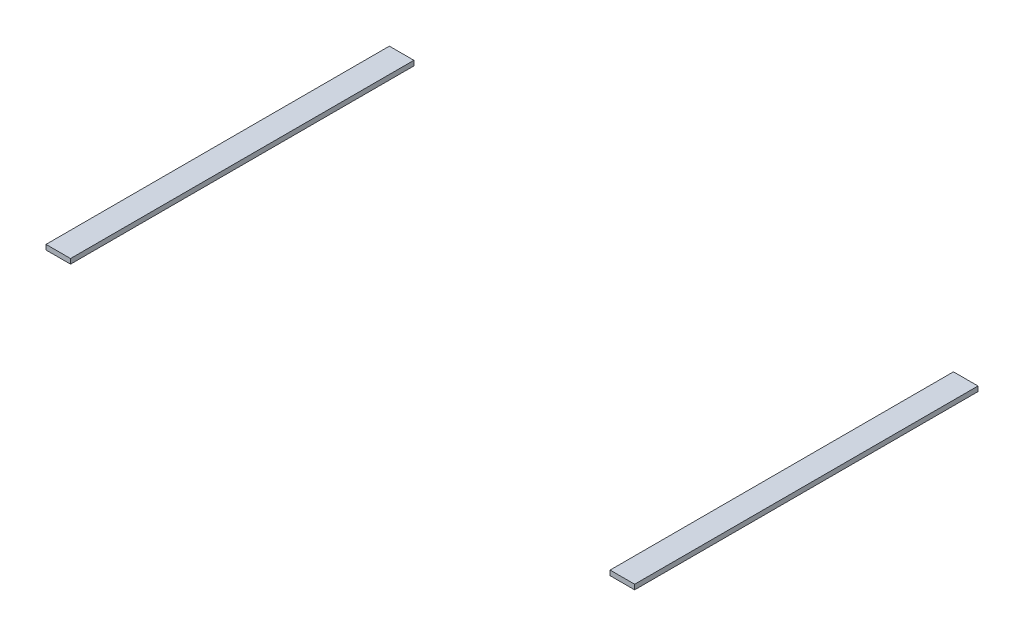
ISO-10303-21;
HEADER;
FILE_DESCRIPTION(('STEP AP214'),'2;1');
FILE_NAME('part.step','',(''),(''),'','','');
FILE_SCHEMA(('AUTOMOTIVE_DESIGN { 1 0 10303 214 1 1 1 1 }'));
ENDSEC;
DATA;
#1=APPLICATION_CONTEXT('core data for automotive mechanical design processes');
#2=APPLICATION_PROTOCOL_DEFINITION('international standard','automotive_design',2000,#1);
#3=PRODUCT_CONTEXT('',#1,'mechanical');
#4=PRODUCT('Part','Part','',(#3));
#5=PRODUCT_RELATED_PRODUCT_CATEGORY('part','',(#4));
#6=PRODUCT_DEFINITION_FORMATION('','',#4);
#7=PRODUCT_DEFINITION_CONTEXT('part definition',#1,'design');
#8=PRODUCT_DEFINITION('design','',#6,#7);
#9=PRODUCT_DEFINITION_SHAPE('','',#8);
#10=(LENGTH_UNIT() NAMED_UNIT(*) SI_UNIT(.MILLI.,.METRE.));
#11=(NAMED_UNIT(*) PLANE_ANGLE_UNIT() SI_UNIT($,.RADIAN.));
#12=(NAMED_UNIT(*) SI_UNIT($,.STERADIAN.) SOLID_ANGLE_UNIT());
#13=UNCERTAINTY_MEASURE_WITH_UNIT(LENGTH_MEASURE(1.E-05),#10,'distance_accuracy_value','');
#14=(GEOMETRIC_REPRESENTATION_CONTEXT(3) GLOBAL_UNCERTAINTY_ASSIGNED_CONTEXT((#13)) GLOBAL_UNIT_ASSIGNED_CONTEXT((#10,
#11,#12)) REPRESENTATION_CONTEXT('',''));
#15=CARTESIAN_POINT('',(0.,0.,0.));
#16=DIRECTION('',(0.,0.,1.));
#17=DIRECTION('',(1.,0.,0.));
#18=AXIS2_PLACEMENT_3D('',#15,#16,#17);
#19=CARTESIAN_POINT('',(120.,2.,70.));
#20=DIRECTION('',(0.,0.,-1.));
#21=DIRECTION('',(-1.,0.,0.));
#22=AXIS2_PLACEMENT_3D('',#19,#20,#21);
#23=PLANE('',#22);
#24=DIRECTION('',(0.,-1.,0.));
#25=VECTOR('',#24,1.);
#26=CARTESIAN_POINT('',(-110.,2.,70.));
#27=LINE('',#26,#25);
#28=CARTESIAN_POINT('',(-110.,2.,70.));
#29=VERTEX_POINT('',#28);
#30=CARTESIAN_POINT('',(-110.,0.,70.));
#31=VERTEX_POINT('',#30);
#32=EDGE_CURVE('E12',#29,#31,#27,.T.);
#33=ORIENTED_EDGE('',*,*,#32,.F.);
#34=DIRECTION('',(1.,0.,0.));
#35=VECTOR('',#34,1.);
#36=CARTESIAN_POINT('',(120.,2.,70.));
#37=LINE('',#36,#35);
#38=CARTESIAN_POINT('',(-120.,2.,70.));
#39=VERTEX_POINT('',#38);
#40=EDGE_CURVE('E93',#39,#29,#37,.T.);
#41=ORIENTED_EDGE('',*,*,#40,.F.);
#42=DIRECTION('',(0.,-1.,0.));
#43=VECTOR('',#42,1.);
#44=CARTESIAN_POINT('',(-120.,2.,70.));
#45=LINE('',#44,#43);
#46=CARTESIAN_POINT('',(-120.,0.,70.));
#47=VERTEX_POINT('',#46);
#48=EDGE_CURVE('E117',#39,#47,#45,.T.);
#49=ORIENTED_EDGE('',*,*,#48,.T.);
#50=DIRECTION('',(1.,0.,0.));
#51=VECTOR('',#50,1.);
#52=CARTESIAN_POINT('',(120.,0.,70.));
#53=LINE('',#52,#51);
#54=EDGE_CURVE('E47',#47,#31,#53,.T.);
#55=ORIENTED_EDGE('',*,*,#54,.T.);
#56=EDGE_LOOP('',(#33,#41,#49,#55));
#57=FACE_BOUND('',#56,.T.);
#58=ADVANCED_FACE('F44',(#57),#23,.F.);
#59=CARTESIAN_POINT('',(120.,2.,-70.));
#60=DIRECTION('',(0.,0.,1.));
#61=DIRECTION('',(1.,0.,0.));
#62=AXIS2_PLACEMENT_3D('',#59,#60,#61);
#63=PLANE('',#62);
#64=DIRECTION('',(0.,-1.,0.));
#65=VECTOR('',#64,1.);
#66=CARTESIAN_POINT('',(-110.,2.,-70.));
#67=LINE('',#66,#65);
#68=CARTESIAN_POINT('',(-110.,2.,-70.));
#69=VERTEX_POINT('',#68);
#70=CARTESIAN_POINT('',(-110.,0.,-70.));
#71=VERTEX_POINT('',#70);
#72=EDGE_CURVE('E78',#69,#71,#67,.T.);
#73=ORIENTED_EDGE('',*,*,#72,.T.);
#74=DIRECTION('',(-1.,0.,0.));
#75=VECTOR('',#74,1.);
#76=CARTESIAN_POINT('',(120.,0.,-70.));
#77=LINE('',#76,#75);
#78=CARTESIAN_POINT('',(-120.,0.,-70.));
#79=VERTEX_POINT('',#78);
#80=EDGE_CURVE('E85',#71,#79,#77,.T.);
#81=ORIENTED_EDGE('',*,*,#80,.T.);
#82=DIRECTION('',(0.,-1.,0.));
#83=VECTOR('',#82,1.);
#84=CARTESIAN_POINT('',(-120.,2.,-70.));
#85=LINE('',#84,#83);
#86=CARTESIAN_POINT('',(-120.,2.,-70.));
#87=VERTEX_POINT('',#86);
#88=EDGE_CURVE('E94',#87,#79,#85,.T.);
#89=ORIENTED_EDGE('',*,*,#88,.F.);
#90=DIRECTION('',(-1.,0.,0.));
#91=VECTOR('',#90,1.);
#92=CARTESIAN_POINT('',(120.,2.,-70.));
#93=LINE('',#92,#91);
#94=EDGE_CURVE('E91',#69,#87,#93,.T.);
#95=ORIENTED_EDGE('',*,*,#94,.F.);
#96=EDGE_LOOP('',(#73,#81,#89,#95));
#97=FACE_BOUND('',#96,.T.);
#98=ADVANCED_FACE('F96',(#97),#63,.F.);
#99=CARTESIAN_POINT('',(0.,2.,0.));
#100=DIRECTION('',(0.,1.,0.));
#101=DIRECTION('',(0.,0.,1.));
#102=AXIS2_PLACEMENT_3D('',#99,#100,#101);
#103=PLANE('',#102);
#104=ORIENTED_EDGE('',*,*,#40,.T.);
#105=DIRECTION('',(0.,0.,1.));
#106=VECTOR('',#105,1.);
#107=CARTESIAN_POINT('',(-110.,2.,-70.));
#108=LINE('',#107,#106);
#109=EDGE_CURVE('E53',#69,#29,#108,.T.);
#110=ORIENTED_EDGE('',*,*,#109,.F.);
#111=ORIENTED_EDGE('',*,*,#94,.T.);
#112=DIRECTION('',(0.,0.,1.));
#113=VECTOR('',#112,1.);
#114=CARTESIAN_POINT('',(-120.,2.,70.));
#115=LINE('',#114,#113);
#116=EDGE_CURVE('E99',#87,#39,#115,.T.);
#117=ORIENTED_EDGE('',*,*,#116,.T.);
#118=EDGE_LOOP('',(#104,#110,#111,#117));
#119=FACE_BOUND('',#118,.T.);
#120=ADVANCED_FACE('F89',(#119),#103,.T.);
#121=CARTESIAN_POINT('',(0.,0.,0.));
#122=DIRECTION('',(0.,1.,0.));
#123=DIRECTION('',(0.,0.,1.));
#124=AXIS2_PLACEMENT_3D('',#121,#122,#123);
#125=PLANE('',#124);
#126=DIRECTION('',(0.,0.,1.));
#127=VECTOR('',#126,1.);
#128=CARTESIAN_POINT('',(-110.,0.,-70.));
#129=LINE('',#128,#127);
#130=EDGE_CURVE('E81',#71,#31,#129,.T.);
#131=ORIENTED_EDGE('',*,*,#130,.T.);
#132=ORIENTED_EDGE('',*,*,#54,.F.);
#133=DIRECTION('',(0.,0.,1.));
#134=VECTOR('',#133,1.);
#135=CARTESIAN_POINT('',(-120.,0.,70.));
#136=LINE('',#135,#134);
#137=EDGE_CURVE('E110',#79,#47,#136,.T.);
#138=ORIENTED_EDGE('',*,*,#137,.F.);
#139=ORIENTED_EDGE('',*,*,#80,.F.);
#140=EDGE_LOOP('',(#131,#132,#138,#139));
#141=FACE_BOUND('',#140,.T.);
#142=ADVANCED_FACE('F112',(#141),#125,.F.);
#143=CARTESIAN_POINT('',(-120.,2.,70.));
#144=DIRECTION('',(1.,0.,0.));
#145=DIRECTION('',(0.,0.,-1.));
#146=AXIS2_PLACEMENT_3D('',#143,#144,#145);
#147=PLANE('',#146);
#148=ORIENTED_EDGE('',*,*,#137,.T.);
#149=ORIENTED_EDGE('',*,*,#48,.F.);
#150=ORIENTED_EDGE('',*,*,#116,.F.);
#151=ORIENTED_EDGE('',*,*,#88,.T.);
#152=EDGE_LOOP('',(#148,#149,#150,#151));
#153=FACE_BOUND('',#152,.T.);
#154=ADVANCED_FACE('F108',(#153),#147,.F.);
#155=CARTESIAN_POINT('',(-110.,2.,-70.));
#156=DIRECTION('',(1.,0.,0.));
#157=DIRECTION('',(0.,0.,-1.));
#158=AXIS2_PLACEMENT_3D('',#155,#156,#157);
#159=PLANE('',#158);
#160=ORIENTED_EDGE('',*,*,#130,.F.);
#161=ORIENTED_EDGE('',*,*,#72,.F.);
#162=ORIENTED_EDGE('',*,*,#109,.T.);
#163=ORIENTED_EDGE('',*,*,#32,.T.);
#164=EDGE_LOOP('',(#160,#161,#162,#163));
#165=FACE_BOUND('',#164,.T.);
#166=ADVANCED_FACE('F80',(#165),#159,.T.);
#167=CLOSED_SHELL('',(#58,#98,#120,#142,#154,#166));
#168=MANIFOLD_SOLID_BREP('B2',#167);
#169=CARTESIAN_POINT('',(120.,2.,70.));
#170=DIRECTION('',(-1.,0.,0.));
#171=DIRECTION('',(0.,0.,1.));
#172=AXIS2_PLACEMENT_3D('',#169,#170,#171);
#173=PLANE('',#172);
#174=DIRECTION('',(0.,0.,-1.));
#175=VECTOR('',#174,1.);
#176=CARTESIAN_POINT('',(120.,0.,70.));
#177=LINE('',#176,#175);
#178=CARTESIAN_POINT('',(120.,0.,70.));
#179=VERTEX_POINT('',#178);
#180=CARTESIAN_POINT('',(120.,0.,-70.));
#181=VERTEX_POINT('',#180);
#182=EDGE_CURVE('E203',#179,#181,#177,.T.);
#183=ORIENTED_EDGE('',*,*,#182,.T.);
#184=DIRECTION('',(0.,-1.,0.));
#185=VECTOR('',#184,1.);
#186=CARTESIAN_POINT('',(120.,2.,-70.));
#187=LINE('',#186,#185);
#188=CARTESIAN_POINT('',(120.,2.,-70.));
#189=VERTEX_POINT('',#188);
#190=EDGE_CURVE('E175',#189,#181,#187,.T.);
#191=ORIENTED_EDGE('',*,*,#190,.F.);
#192=DIRECTION('',(0.,0.,-1.));
#193=VECTOR('',#192,1.);
#194=CARTESIAN_POINT('',(120.,2.,70.));
#195=LINE('',#194,#193);
#196=CARTESIAN_POINT('',(120.,2.,70.));
#197=VERTEX_POINT('',#196);
#198=EDGE_CURVE('E191',#197,#189,#195,.T.);
#199=ORIENTED_EDGE('',*,*,#198,.F.);
#200=DIRECTION('',(0.,-1.,0.));
#201=VECTOR('',#200,1.);
#202=CARTESIAN_POINT('',(120.,2.,70.));
#203=LINE('',#202,#201);
#204=EDGE_CURVE('E42',#197,#179,#203,.T.);
#205=ORIENTED_EDGE('',*,*,#204,.T.);
#206=EDGE_LOOP('',(#183,#191,#199,#205));
#207=FACE_BOUND('',#206,.T.);
#208=ADVANCED_FACE('F167',(#207),#173,.F.);
#209=CARTESIAN_POINT('',(0.,0.,0.));
#210=DIRECTION('',(0.,1.,0.));
#211=DIRECTION('',(0.,0.,1.));
#212=AXIS2_PLACEMENT_3D('',#209,#210,#211);
#213=PLANE('',#212);
#214=DIRECTION('',(0.,0.,-1.));
#215=VECTOR('',#214,1.);
#216=CARTESIAN_POINT('',(110.,0.,-70.));
#217=LINE('',#216,#215);
#218=CARTESIAN_POINT('',(110.,0.,70.));
#219=VERTEX_POINT('',#218);
#220=CARTESIAN_POINT('',(110.,0.,-70.));
#221=VERTEX_POINT('',#220);
#222=EDGE_CURVE('E218',#219,#221,#217,.T.);
#223=ORIENTED_EDGE('',*,*,#222,.T.);
#224=DIRECTION('',(-1.,0.,0.));
#225=VECTOR('',#224,1.);
#226=CARTESIAN_POINT('',(120.,0.,-70.));
#227=LINE('',#226,#225);
#228=EDGE_CURVE('E210',#181,#221,#227,.T.);
#229=ORIENTED_EDGE('',*,*,#228,.F.);
#230=ORIENTED_EDGE('',*,*,#182,.F.);
#231=DIRECTION('',(1.,0.,0.));
#232=VECTOR('',#231,1.);
#233=CARTESIAN_POINT('',(120.,0.,70.));
#234=LINE('',#233,#232);
#235=EDGE_CURVE('E211',#219,#179,#234,.T.);
#236=ORIENTED_EDGE('',*,*,#235,.F.);
#237=EDGE_LOOP('',(#223,#229,#230,#236));
#238=FACE_BOUND('',#237,.T.);
#239=ADVANCED_FACE('F217',(#238),#213,.F.);
#240=CARTESIAN_POINT('',(0.,2.,0.));
#241=DIRECTION('',(0.,1.,0.));
#242=DIRECTION('',(0.,0.,1.));
#243=AXIS2_PLACEMENT_3D('',#240,#241,#242);
#244=PLANE('',#243);
#245=DIRECTION('',(-1.,0.,0.));
#246=VECTOR('',#245,1.);
#247=CARTESIAN_POINT('',(120.,2.,-70.));
#248=LINE('',#247,#246);
#249=CARTESIAN_POINT('',(110.,2.,-70.));
#250=VERTEX_POINT('',#249);
#251=EDGE_CURVE('E216',#189,#250,#248,.T.);
#252=ORIENTED_EDGE('',*,*,#251,.T.);
#253=DIRECTION('',(0.,0.,-1.));
#254=VECTOR('',#253,1.);
#255=CARTESIAN_POINT('',(110.,2.,-70.));
#256=LINE('',#255,#254);
#257=CARTESIAN_POINT('',(110.,2.,70.));
#258=VERTEX_POINT('',#257);
#259=EDGE_CURVE('E230',#258,#250,#256,.T.);
#260=ORIENTED_EDGE('',*,*,#259,.F.);
#261=DIRECTION('',(1.,0.,0.));
#262=VECTOR('',#261,1.);
#263=CARTESIAN_POINT('',(120.,2.,70.));
#264=LINE('',#263,#262);
#265=EDGE_CURVE('E219',#258,#197,#264,.T.);
#266=ORIENTED_EDGE('',*,*,#265,.T.);
#267=ORIENTED_EDGE('',*,*,#198,.T.);
#268=EDGE_LOOP('',(#252,#260,#266,#267));
#269=FACE_BOUND('',#268,.T.);
#270=ADVANCED_FACE('F238',(#269),#244,.T.);
#271=CARTESIAN_POINT('',(120.,2.,-70.));
#272=DIRECTION('',(0.,0.,1.));
#273=DIRECTION('',(1.,0.,0.));
#274=AXIS2_PLACEMENT_3D('',#271,#272,#273);
#275=PLANE('',#274);
#276=DIRECTION('',(0.,-1.,0.));
#277=VECTOR('',#276,1.);
#278=CARTESIAN_POINT('',(110.,2.,-70.));
#279=LINE('',#278,#277);
#280=EDGE_CURVE('E182',#250,#221,#279,.T.);
#281=ORIENTED_EDGE('',*,*,#280,.F.);
#282=ORIENTED_EDGE('',*,*,#251,.F.);
#283=ORIENTED_EDGE('',*,*,#190,.T.);
#284=ORIENTED_EDGE('',*,*,#228,.T.);
#285=EDGE_LOOP('',(#281,#282,#283,#284));
#286=FACE_BOUND('',#285,.T.);
#287=ADVANCED_FACE('F215',(#286),#275,.F.);
#288=CARTESIAN_POINT('',(120.,2.,70.));
#289=DIRECTION('',(0.,0.,-1.));
#290=DIRECTION('',(-1.,0.,0.));
#291=AXIS2_PLACEMENT_3D('',#288,#289,#290);
#292=PLANE('',#291);
#293=DIRECTION('',(0.,-1.,0.));
#294=VECTOR('',#293,1.);
#295=CARTESIAN_POINT('',(110.,2.,70.));
#296=LINE('',#295,#294);
#297=EDGE_CURVE('E224',#258,#219,#296,.T.);
#298=ORIENTED_EDGE('',*,*,#297,.T.);
#299=ORIENTED_EDGE('',*,*,#235,.T.);
#300=ORIENTED_EDGE('',*,*,#204,.F.);
#301=ORIENTED_EDGE('',*,*,#265,.F.);
#302=EDGE_LOOP('',(#298,#299,#300,#301));
#303=FACE_BOUND('',#302,.T.);
#304=ADVANCED_FACE('F169',(#303),#292,.F.);
#305=CARTESIAN_POINT('',(110.,2.,-70.));
#306=DIRECTION('',(-1.,0.,0.));
#307=DIRECTION('',(0.,0.,1.));
#308=AXIS2_PLACEMENT_3D('',#305,#306,#307);
#309=PLANE('',#308);
#310=ORIENTED_EDGE('',*,*,#222,.F.);
#311=ORIENTED_EDGE('',*,*,#297,.F.);
#312=ORIENTED_EDGE('',*,*,#259,.T.);
#313=ORIENTED_EDGE('',*,*,#280,.T.);
#314=EDGE_LOOP('',(#310,#311,#312,#313));
#315=FACE_BOUND('',#314,.T.);
#316=ADVANCED_FACE('F234',(#315),#309,.T.);
#317=CLOSED_SHELL('',(#208,#239,#270,#287,#304,#316));
#318=MANIFOLD_SOLID_BREP('B6',#317);
#319=ADVANCED_BREP_SHAPE_REPRESENTATION('',(#18,#168,#318),#14);
#320=SHAPE_DEFINITION_REPRESENTATION(#9,#319);
ENDSEC;
END-ISO-10303-21;
